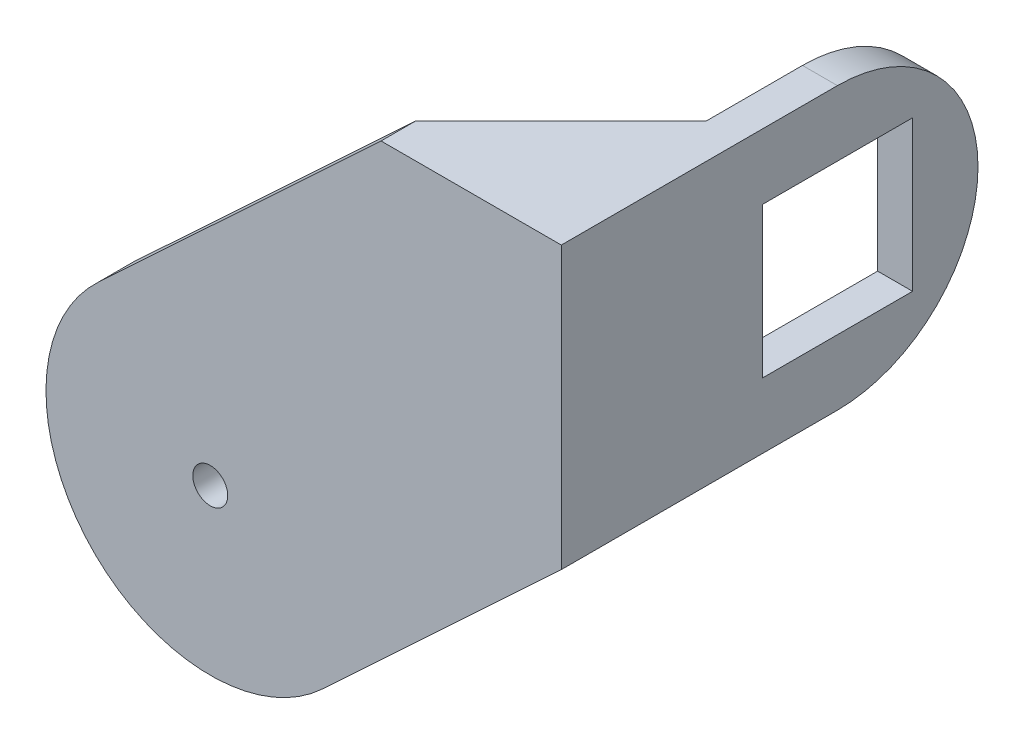
ISO-10303-21;
HEADER;
FILE_DESCRIPTION(('STEP AP214'),'2;1');
FILE_NAME('part.step','',(''),(''),'','','');
FILE_SCHEMA(('AUTOMOTIVE_DESIGN { 1 0 10303 214 1 1 1 1 }'));
ENDSEC;
DATA;
#1=APPLICATION_CONTEXT('core data for automotive mechanical design processes');
#2=APPLICATION_PROTOCOL_DEFINITION('international standard','automotive_design',2000,#1);
#3=PRODUCT_CONTEXT('',#1,'mechanical');
#4=PRODUCT('Part','Part','',(#3));
#5=PRODUCT_RELATED_PRODUCT_CATEGORY('part','',(#4));
#6=PRODUCT_DEFINITION_FORMATION('','',#4);
#7=PRODUCT_DEFINITION_CONTEXT('part definition',#1,'design');
#8=PRODUCT_DEFINITION('design','',#6,#7);
#9=PRODUCT_DEFINITION_SHAPE('','',#8);
#10=(LENGTH_UNIT() NAMED_UNIT(*) SI_UNIT(.MILLI.,.METRE.));
#11=(NAMED_UNIT(*) PLANE_ANGLE_UNIT() SI_UNIT($,.RADIAN.));
#12=(NAMED_UNIT(*) SI_UNIT($,.STERADIAN.) SOLID_ANGLE_UNIT());
#13=UNCERTAINTY_MEASURE_WITH_UNIT(LENGTH_MEASURE(1.E-05),#10,'distance_accuracy_value','');
#14=(GEOMETRIC_REPRESENTATION_CONTEXT(3) GLOBAL_UNCERTAINTY_ASSIGNED_CONTEXT((#13)) GLOBAL_UNIT_ASSIGNED_CONTEXT((#10,
#11,#12)) REPRESENTATION_CONTEXT('',''));
#15=CARTESIAN_POINT('',(0.,0.,0.));
#16=DIRECTION('',(0.,0.,1.));
#17=DIRECTION('',(1.,0.,0.));
#18=AXIS2_PLACEMENT_3D('',#15,#16,#17);
#19=CARTESIAN_POINT('',(831.596262739979,0.,0.));
#20=DIRECTION('',(1.,0.,0.));
#21=DIRECTION('',(0.,0.,-1.));
#22=AXIS2_PLACEMENT_3D('',#19,#20,#21);
#23=PLANE('',#22);
#24=DIRECTION('',(0.,0.,-1.));
#25=VECTOR('',#24,1.);
#26=CARTESIAN_POINT('',(831.596262739979,764.961811027833,0.));
#27=LINE('',#26,#25);
#28=CARTESIAN_POINT('',(831.596262739979,764.961811027833,-47.5000000000001));
#29=VERTEX_POINT('',#28);
#30=CARTESIAN_POINT('',(831.596262739979,764.961811027833,-90.5000000000001));
#31=VERTEX_POINT('',#30);
#32=EDGE_CURVE('E196',#29,#31,#27,.T.);
#33=ORIENTED_EDGE('',*,*,#32,.F.);
#34=DIRECTION('',(0.,-1.,0.));
#35=VECTOR('',#34,1.);
#36=CARTESIAN_POINT('',(831.596262739979,0.,-47.5000000000003));
#37=LINE('',#36,#35);
#38=CARTESIAN_POINT('',(831.596262739979,721.961811027833,-47.5000000000001));
#39=VERTEX_POINT('',#38);
#40=EDGE_CURVE('E204',#29,#39,#37,.T.);
#41=ORIENTED_EDGE('',*,*,#40,.T.);
#42=DIRECTION('',(0.,0.,-1.));
#43=VECTOR('',#42,1.);
#44=CARTESIAN_POINT('',(831.596262739979,721.961811027833,0.));
#45=LINE('',#44,#43);
#46=CARTESIAN_POINT('',(831.596262739979,721.961811027833,-90.5000000000001));
#47=VERTEX_POINT('',#46);
#48=EDGE_CURVE('E202',#39,#47,#45,.T.);
#49=ORIENTED_EDGE('',*,*,#48,.T.);
#50=DIRECTION('',(0.,-1.,0.));
#51=VECTOR('',#50,1.);
#52=CARTESIAN_POINT('',(831.596262739979,0.,-90.5000000000003));
#53=LINE('',#52,#51);
#54=EDGE_CURVE('E199',#31,#47,#53,.T.);
#55=ORIENTED_EDGE('',*,*,#54,.F.);
#56=EDGE_LOOP('',(#33,#41,#49,#55));
#57=FACE_BOUND('',#56,.T.);
#58=DIRECTION('',(0.,-1.,0.));
#59=VECTOR('',#58,1.);
#60=CARTESIAN_POINT('',(831.596262739979,713.245406231609,-41.5766151838099));
#61=LINE('',#60,#59);
#62=CARTESIAN_POINT('',(831.596262739979,713.245406231609,-41.5766151838099));
#63=VERTEX_POINT('',#62);
#64=CARTESIAN_POINT('',(831.596262739979,703.245406231609,-41.5766151838099));
#65=VERTEX_POINT('',#64);
#66=EDGE_CURVE('E179',#63,#65,#61,.T.);
#67=ORIENTED_EDGE('',*,*,#66,.F.);
#68=DIRECTION('',(0.,0.,-1.));
#69=VECTOR('',#68,1.);
#70=CARTESIAN_POINT('',(831.596262739979,713.245406231609,0.));
#71=LINE('',#70,#69);
#72=CARTESIAN_POINT('',(831.596262739979,713.245406231609,0.));
#73=VERTEX_POINT('',#72);
#74=EDGE_CURVE('E281',#73,#63,#71,.T.);
#75=ORIENTED_EDGE('',*,*,#74,.F.);
#76=DIRECTION('',(0.,1.,0.));
#77=VECTOR('',#76,1.);
#78=CARTESIAN_POINT('',(831.596262739979,0.,0.));
#79=LINE('',#78,#77);
#80=CARTESIAN_POINT('',(831.596262739979,773.678215824057,0.));
#81=VERTEX_POINT('',#80);
#82=EDGE_CURVE('E163',#73,#81,#79,.T.);
#83=ORIENTED_EDGE('',*,*,#82,.T.);
#84=DIRECTION('',(0.,0.,-1.));
#85=VECTOR('',#84,1.);
#86=CARTESIAN_POINT('',(831.596262739979,773.678215824057,0.));
#87=LINE('',#86,#85);
#88=CARTESIAN_POINT('',(831.596262739979,773.678215824057,-41.5766151838099));
#89=VERTEX_POINT('',#88);
#90=EDGE_CURVE('E169',#81,#89,#87,.T.);
#91=ORIENTED_EDGE('',*,*,#90,.T.);
#92=DIRECTION('',(0.,1.,0.));
#93=VECTOR('',#92,1.);
#94=CARTESIAN_POINT('',(831.596262739979,773.678215824057,-41.5766151838099));
#95=LINE('',#94,#93);
#96=CARTESIAN_POINT('',(831.596262739979,783.678215824057,-41.5766151838099));
#97=VERTEX_POINT('',#96);
#98=EDGE_CURVE('E167',#89,#97,#95,.T.);
#99=ORIENTED_EDGE('',*,*,#98,.T.);
#100=DIRECTION('',(0.,0.,-1.));
#101=VECTOR('',#100,1.);
#102=CARTESIAN_POINT('',(831.596262739979,783.678215824057,0.));
#103=LINE('',#102,#101);
#104=CARTESIAN_POINT('',(831.596262739979,783.678215824057,-69.));
#105=VERTEX_POINT('',#104);
#106=EDGE_CURVE('E152',#97,#105,#103,.T.);
#107=ORIENTED_EDGE('',*,*,#106,.T.);
#108=CARTESIAN_POINT('',(831.596262739979,743.461811027833,-69.));
#109=DIRECTION('',(1.,0.,0.));
#110=DIRECTION('',(0.,0.,-1.));
#111=AXIS2_PLACEMENT_3D('',#108,#109,#110);
#112=CIRCLE('',#111,40.2164047962241);
#113=CARTESIAN_POINT('',(831.596262739979,703.245406231609,-69.));
#114=VERTEX_POINT('',#113);
#115=EDGE_CURVE('E164',#105,#114,#112,.F.);
#116=ORIENTED_EDGE('',*,*,#115,.T.);
#117=DIRECTION('',(0.,0.,1.));
#118=VECTOR('',#117,1.);
#119=CARTESIAN_POINT('',(831.596262739979,703.245406231609,0.));
#120=LINE('',#119,#118);
#121=EDGE_CURVE('E194',#114,#65,#120,.T.);
#122=ORIENTED_EDGE('',*,*,#121,.T.);
#123=EDGE_LOOP('',(#67,#75,#83,#91,#99,#107,#116,#122));
#124=FACE_BOUND('',#123,.T.);
#125=ADVANCED_FACE('F43',(#57,#124),#23,.F.);
#126=CARTESIAN_POINT('',(0.,0.,0.));
#127=DIRECTION('',(0.,0.,1.));
#128=DIRECTION('',(1.,0.,0.));
#129=AXIS2_PLACEMENT_3D('',#126,#127,#128);
#130=PLANE('',#129);
#131=CARTESIAN_POINT('',(741.160932352825,673.852336136002,0.));
#132=DIRECTION('',(0.,0.,1.));
#133=DIRECTION('',(1.,0.,0.));
#134=AXIS2_PLACEMENT_3D('',#131,#132,#133);
#135=CIRCLE('',#134,5.00000000000005);
#136=CARTESIAN_POINT('',(746.160932352825,673.852336136002,0.));
#137=VERTEX_POINT('',#136);
#138=EDGE_CURVE('E224',#137,#137,#135,.T.);
#139=ORIENTED_EDGE('',*,*,#138,.T.);
#140=EDGE_LOOP('',(#139));
#141=FACE_BOUND('',#140,.T.);
#142=ORIENTED_EDGE('',*,*,#82,.F.);
#143=DIRECTION('',(1.,0.,0.));
#144=VECTOR('',#143,1.);
#145=CARTESIAN_POINT('',(831.596262739979,713.245406231609,0.));
#146=LINE('',#145,#144);
#147=CARTESIAN_POINT('',(790.019647556168,713.245406231609,0.));
#148=VERTEX_POINT('',#147);
#149=EDGE_CURVE('E58',#148,#73,#146,.T.);
#150=ORIENTED_EDGE('',*,*,#149,.F.);
#151=DIRECTION('',(0.,-1.,0.));
#152=VECTOR('',#151,1.);
#153=CARTESIAN_POINT('',(790.019647556168,713.245406231609,0.));
#154=LINE('',#153,#152);
#155=CARTESIAN_POINT('',(790.019647556168,703.245406231609,0.));
#156=VERTEX_POINT('',#155);
#157=EDGE_CURVE('E184',#148,#156,#154,.T.);
#158=ORIENTED_EDGE('',*,*,#157,.T.);
#159=DIRECTION('',(1.,0.,0.));
#160=VECTOR('',#159,1.);
#161=CARTESIAN_POINT('',(831.596262739979,703.245406231609,0.));
#162=LINE('',#161,#160);
#163=CARTESIAN_POINT('',(841.596262739979,703.245406231609,0.));
#164=VERTEX_POINT('',#163);
#165=EDGE_CURVE('E66',#156,#164,#162,.T.);
#166=ORIENTED_EDGE('',*,*,#165,.T.);
#167=DIRECTION('',(0.731353701619169,0.6819983600625,0.));
#168=VECTOR('',#167,1.);
#169=CARTESIAN_POINT('',(40.6785696839934,-43.622425297673,0.));
#170=LINE('',#169,#168);
#171=CARTESIAN_POINT('',(773.214855275763,639.478712159901,0.));
#172=VERTEX_POINT('',#171);
#173=EDGE_CURVE('E241',#172,#164,#170,.T.);
#174=ORIENTED_EDGE('',*,*,#173,.F.);
#175=CARTESIAN_POINT('',(741.160932352825,673.852336136002,0.));
#176=DIRECTION('',(0.,0.,1.));
#177=DIRECTION('',(1.,0.,0.));
#178=AXIS2_PLACEMENT_3D('',#175,#176,#177);
#179=CIRCLE('',#178,47.);
#180=CARTESIAN_POINT('',(709.107009429888,708.225960112103,0.));
#181=VERTEX_POINT('',#180);
#182=EDGE_CURVE('E258',#181,#172,#179,.T.);
#183=ORIENTED_EDGE('',*,*,#182,.F.);
#184=DIRECTION('',(-0.731353701619169,-0.6819983600625,0.));
#185=VECTOR('',#184,1.);
#186=CARTESIAN_POINT('',(-23.4292761618817,25.124822654529,0.));
#187=LINE('',#186,#185);
#188=CARTESIAN_POINT('',(790.019647556168,783.678215824057,0.));
#189=VERTEX_POINT('',#188);
#190=EDGE_CURVE('E255',#189,#181,#187,.T.);
#191=ORIENTED_EDGE('',*,*,#190,.F.);
#192=DIRECTION('',(0.,1.,0.));
#193=VECTOR('',#192,1.);
#194=CARTESIAN_POINT('',(790.019647556168,773.678215824057,0.));
#195=LINE('',#194,#193);
#196=CARTESIAN_POINT('',(790.019647556168,773.678215824057,0.));
#197=VERTEX_POINT('',#196);
#198=EDGE_CURVE('E173',#197,#189,#195,.T.);
#199=ORIENTED_EDGE('',*,*,#198,.F.);
#200=DIRECTION('',(1.,0.,0.));
#201=VECTOR('',#200,1.);
#202=CARTESIAN_POINT('',(831.596262739979,773.678215824057,0.));
#203=LINE('',#202,#201);
#204=EDGE_CURVE('E178',#197,#81,#203,.T.);
#205=ORIENTED_EDGE('',*,*,#204,.T.);
#206=EDGE_LOOP('',(#142,#150,#158,#166,#174,#183,#191,#199,#205));
#207=FACE_BOUND('',#206,.T.);
#208=ADVANCED_FACE('F275',(#141,#207),#130,.F.);
#209=CARTESIAN_POINT('',(-23.4292761618817,25.124822654529,10.));
#210=DIRECTION('',(0.6819983600625,-0.731353701619169,0.));
#211=DIRECTION('',(0.731353701619169,0.6819983600625,0.));
#212=AXIS2_PLACEMENT_3D('',#209,#210,#211);
#213=PLANE('',#212);
#214=ORIENTED_EDGE('',*,*,#190,.T.);
#215=DIRECTION('',(0.,0.,-1.));
#216=VECTOR('',#215,1.);
#217=CARTESIAN_POINT('',(709.107009429888,708.225960112103,10.));
#218=LINE('',#217,#216);
#219=CARTESIAN_POINT('',(709.107009429888,708.225960112103,10.));
#220=VERTEX_POINT('',#219);
#221=EDGE_CURVE('E11',#220,#181,#218,.T.);
#222=ORIENTED_EDGE('',*,*,#221,.F.);
#223=DIRECTION('',(-0.731353701619169,-0.6819983600625,0.));
#224=VECTOR('',#223,1.);
#225=CARTESIAN_POINT('',(-23.4292761618817,25.124822654529,10.));
#226=LINE('',#225,#224);
#227=CARTESIAN_POINT('',(790.019647556168,783.678215824057,10.));
#228=VERTEX_POINT('',#227);
#229=EDGE_CURVE('E240',#228,#220,#226,.T.);
#230=ORIENTED_EDGE('',*,*,#229,.F.);
#231=DIRECTION('',(0.,0.,-1.));
#232=VECTOR('',#231,1.);
#233=CARTESIAN_POINT('',(790.019647556168,783.678215824057,10.));
#234=LINE('',#233,#232);
#235=EDGE_CURVE('E252',#228,#189,#234,.T.);
#236=ORIENTED_EDGE('',*,*,#235,.T.);
#237=EDGE_LOOP('',(#214,#222,#230,#236));
#238=FACE_BOUND('',#237,.T.);
#239=ADVANCED_FACE('F295',(#238),#213,.F.);
#240=CARTESIAN_POINT('',(741.160932352825,673.852336136002,10.));
#241=DIRECTION('',(0.,0.,-1.));
#242=DIRECTION('',(-1.,0.,0.));
#243=AXIS2_PLACEMENT_3D('',#240,#241,#242);
#244=CYLINDRICAL_SURFACE('',#243,47.);
#245=ORIENTED_EDGE('',*,*,#182,.T.);
#246=DIRECTION('',(0.,0.,-1.));
#247=VECTOR('',#246,1.);
#248=CARTESIAN_POINT('',(773.214855275763,639.478712159901,10.));
#249=LINE('',#248,#247);
#250=CARTESIAN_POINT('',(773.214855275763,639.478712159901,10.));
#251=VERTEX_POINT('',#250);
#252=EDGE_CURVE('E51',#251,#172,#249,.T.);
#253=ORIENTED_EDGE('',*,*,#252,.F.);
#254=CARTESIAN_POINT('',(741.160932352825,673.852336136002,10.));
#255=DIRECTION('',(0.,0.,1.));
#256=DIRECTION('',(1.,0.,0.));
#257=AXIS2_PLACEMENT_3D('',#254,#255,#256);
#258=CIRCLE('',#257,47.);
#259=EDGE_CURVE('E244',#220,#251,#258,.T.);
#260=ORIENTED_EDGE('',*,*,#259,.F.);
#261=ORIENTED_EDGE('',*,*,#221,.T.);
#262=EDGE_LOOP('',(#245,#253,#260,#261));
#263=FACE_BOUND('',#262,.T.);
#264=ADVANCED_FACE('F365',(#263),#244,.T.);
#265=CARTESIAN_POINT('',(40.6785696839934,-43.622425297673,10.));
#266=DIRECTION('',(-0.6819983600625,0.731353701619169,0.));
#267=DIRECTION('',(-0.731353701619169,-0.6819983600625,0.));
#268=AXIS2_PLACEMENT_3D('',#265,#266,#267);
#269=PLANE('',#268);
#270=ORIENTED_EDGE('',*,*,#173,.T.);
#271=DIRECTION('',(0.,0.,-1.));
#272=VECTOR('',#271,1.);
#273=CARTESIAN_POINT('',(841.596262739979,703.245406231609,10.));
#274=LINE('',#273,#272);
#275=CARTESIAN_POINT('',(841.596262739979,703.245406231609,10.));
#276=VERTEX_POINT('',#275);
#277=EDGE_CURVE('E265',#276,#164,#274,.T.);
#278=ORIENTED_EDGE('',*,*,#277,.F.);
#279=DIRECTION('',(0.731353701619169,0.6819983600625,0.));
#280=VECTOR('',#279,1.);
#281=CARTESIAN_POINT('',(40.6785696839934,-43.622425297673,10.));
#282=LINE('',#281,#280);
#283=EDGE_CURVE('E246',#251,#276,#282,.T.);
#284=ORIENTED_EDGE('',*,*,#283,.F.);
#285=ORIENTED_EDGE('',*,*,#252,.T.);
#286=EDGE_LOOP('',(#270,#278,#284,#285));
#287=FACE_BOUND('',#286,.T.);
#288=ADVANCED_FACE('F272',(#287),#269,.F.);
#289=CARTESIAN_POINT('',(841.596262739979,0.,10.));
#290=DIRECTION('',(-1.,0.,0.));
#291=DIRECTION('',(0.,0.,1.));
#292=AXIS2_PLACEMENT_3D('',#289,#290,#291);
#293=PLANE('',#292);
#294=ORIENTED_EDGE('',*,*,#277,.T.);
#295=DIRECTION('',(0.,0.,1.));
#296=VECTOR('',#295,1.);
#297=CARTESIAN_POINT('',(841.596262739979,703.245406231609,0.));
#298=LINE('',#297,#296);
#299=CARTESIAN_POINT('',(841.596262739979,703.245406231609,-69.));
#300=VERTEX_POINT('',#299);
#301=EDGE_CURVE('E209',#300,#164,#298,.T.);
#302=ORIENTED_EDGE('',*,*,#301,.F.);
#303=CARTESIAN_POINT('',(841.596262739979,743.461811027833,-69.));
#304=DIRECTION('',(1.,0.,0.));
#305=DIRECTION('',(0.,0.,-1.));
#306=AXIS2_PLACEMENT_3D('',#303,#304,#305);
#307=CIRCLE('',#306,40.2164047962241);
#308=CARTESIAN_POINT('',(841.596262739979,783.678215824057,-69.));
#309=VERTEX_POINT('',#308);
#310=EDGE_CURVE('E189',#309,#300,#307,.F.);
#311=ORIENTED_EDGE('',*,*,#310,.F.);
#312=DIRECTION('',(0.,0.,-1.));
#313=VECTOR('',#312,1.);
#314=CARTESIAN_POINT('',(841.596262739979,783.678215824057,10.));
#315=LINE('',#314,#313);
#316=CARTESIAN_POINT('',(841.596262739979,783.678215824057,10.));
#317=VERTEX_POINT('',#316);
#318=EDGE_CURVE('E263',#317,#309,#315,.T.);
#319=ORIENTED_EDGE('',*,*,#318,.F.);
#320=DIRECTION('',(0.,1.,0.));
#321=VECTOR('',#320,1.);
#322=CARTESIAN_POINT('',(841.596262739979,0.,10.));
#323=LINE('',#322,#321);
#324=EDGE_CURVE('E248',#276,#317,#323,.T.);
#325=ORIENTED_EDGE('',*,*,#324,.F.);
#326=EDGE_LOOP('',(#294,#302,#311,#319,#325));
#327=FACE_BOUND('',#326,.T.);
#328=DIRECTION('',(0.,0.,-1.));
#329=VECTOR('',#328,1.);
#330=CARTESIAN_POINT('',(841.596262739979,764.961811027833,0.));
#331=LINE('',#330,#329);
#332=CARTESIAN_POINT('',(841.596262739979,764.961811027833,-47.5000000000001));
#333=VERTEX_POINT('',#332);
#334=CARTESIAN_POINT('',(841.596262739979,764.961811027833,-90.5000000000001));
#335=VERTEX_POINT('',#334);
#336=EDGE_CURVE('E211',#333,#335,#331,.T.);
#337=ORIENTED_EDGE('',*,*,#336,.T.);
#338=DIRECTION('',(0.,-1.,0.));
#339=VECTOR('',#338,1.);
#340=CARTESIAN_POINT('',(841.596262739979,0.,-90.5000000000003));
#341=LINE('',#340,#339);
#342=CARTESIAN_POINT('',(841.596262739979,721.961811027833,-90.5000000000001));
#343=VERTEX_POINT('',#342);
#344=EDGE_CURVE('E214',#335,#343,#341,.T.);
#345=ORIENTED_EDGE('',*,*,#344,.T.);
#346=DIRECTION('',(0.,0.,-1.));
#347=VECTOR('',#346,1.);
#348=CARTESIAN_POINT('',(841.596262739979,721.961811027833,0.));
#349=LINE('',#348,#347);
#350=CARTESIAN_POINT('',(841.596262739979,721.961811027833,-47.5000000000001));
#351=VERTEX_POINT('',#350);
#352=EDGE_CURVE('E217',#351,#343,#349,.T.);
#353=ORIENTED_EDGE('',*,*,#352,.F.);
#354=DIRECTION('',(0.,-1.,0.));
#355=VECTOR('',#354,1.);
#356=CARTESIAN_POINT('',(841.596262739979,0.,-47.5000000000003));
#357=LINE('',#356,#355);
#358=EDGE_CURVE('E191',#333,#351,#357,.T.);
#359=ORIENTED_EDGE('',*,*,#358,.F.);
#360=EDGE_LOOP('',(#337,#345,#353,#359));
#361=FACE_BOUND('',#360,.T.);
#362=ADVANCED_FACE('F304',(#327,#361),#293,.F.);
#363=CARTESIAN_POINT('',(741.160932352825,673.852336136002,10.));
#364=DIRECTION('',(0.,0.,-1.));
#365=DIRECTION('',(-1.,0.,0.));
#366=AXIS2_PLACEMENT_3D('',#363,#364,#365);
#367=CYLINDRICAL_SURFACE('',#366,5.00000000000005);
#368=CARTESIAN_POINT('',(741.160932352825,673.852336136002,10.));
#369=DIRECTION('',(0.,0.,1.));
#370=DIRECTION('',(1.,0.,0.));
#371=AXIS2_PLACEMENT_3D('',#368,#369,#370);
#372=CIRCLE('',#371,5.00000000000005);
#373=CARTESIAN_POINT('',(746.160932352825,673.852336136002,10.));
#374=VERTEX_POINT('',#373);
#375=EDGE_CURVE('E237',#374,#374,#372,.T.);
#376=ORIENTED_EDGE('',*,*,#375,.T.);
#377=EDGE_LOOP('',(#376));
#378=FACE_BOUND('',#377,.T.);
#379=ORIENTED_EDGE('',*,*,#138,.F.);
#380=EDGE_LOOP('',(#379));
#381=FACE_BOUND('',#380,.T.);
#382=ADVANCED_FACE('F45',(#378,#381),#367,.F.);
#383=CARTESIAN_POINT('',(0.,783.678215824057,10.));
#384=DIRECTION('',(0.,-1.,0.));
#385=DIRECTION('',(0.,0.,-1.));
#386=AXIS2_PLACEMENT_3D('',#383,#384,#385);
#387=PLANE('',#386);
#388=DIRECTION('',(-0.707106781186551,0.,0.707106781186544));
#389=VECTOR('',#388,1.);
#390=CARTESIAN_POINT('',(790.019647556168,783.678215824057,0.));
#391=LINE('',#390,#389);
#392=EDGE_CURVE('E157',#97,#189,#391,.T.);
#393=ORIENTED_EDGE('',*,*,#392,.T.);
#394=ORIENTED_EDGE('',*,*,#235,.F.);
#395=DIRECTION('',(-1.,0.,0.));
#396=VECTOR('',#395,1.);
#397=CARTESIAN_POINT('',(0.,783.678215824057,10.));
#398=LINE('',#397,#396);
#399=EDGE_CURVE('E250',#317,#228,#398,.T.);
#400=ORIENTED_EDGE('',*,*,#399,.F.);
#401=ORIENTED_EDGE('',*,*,#318,.T.);
#402=DIRECTION('',(1.,0.,0.));
#403=VECTOR('',#402,1.);
#404=CARTESIAN_POINT('',(831.596262739979,783.678215824057,-69.));
#405=LINE('',#404,#403);
#406=EDGE_CURVE('E159',#105,#309,#405,.T.);
#407=ORIENTED_EDGE('',*,*,#406,.F.);
#408=ORIENTED_EDGE('',*,*,#106,.F.);
#409=EDGE_LOOP('',(#393,#394,#400,#401,#407,#408));
#410=FACE_BOUND('',#409,.T.);
#411=ADVANCED_FACE('F154',(#410),#387,.F.);
#412=CARTESIAN_POINT('',(0.,0.,10.));
#413=DIRECTION('',(0.,0.,1.));
#414=DIRECTION('',(1.,0.,0.));
#415=AXIS2_PLACEMENT_3D('',#412,#413,#414);
#416=PLANE('',#415);
#417=ORIENTED_EDGE('',*,*,#375,.F.);
#418=EDGE_LOOP('',(#417));
#419=FACE_BOUND('',#418,.T.);
#420=ORIENTED_EDGE('',*,*,#229,.T.);
#421=ORIENTED_EDGE('',*,*,#259,.T.);
#422=ORIENTED_EDGE('',*,*,#283,.T.);
#423=ORIENTED_EDGE('',*,*,#324,.T.);
#424=ORIENTED_EDGE('',*,*,#399,.T.);
#425=EDGE_LOOP('',(#420,#421,#422,#423,#424));
#426=FACE_BOUND('',#425,.T.);
#427=ADVANCED_FACE('F300',(#419,#426),#416,.T.);
#428=CARTESIAN_POINT('',(831.596262739979,764.961811027833,0.));
#429=DIRECTION('',(0.,-1.,0.));
#430=DIRECTION('',(0.,0.,-1.));
#431=AXIS2_PLACEMENT_3D('',#428,#429,#430);
#432=PLANE('',#431);
#433=ORIENTED_EDGE('',*,*,#336,.F.);
#434=DIRECTION('',(1.,0.,0.));
#435=VECTOR('',#434,1.);
#436=CARTESIAN_POINT('',(831.596262739979,764.961811027833,-47.5000000000001));
#437=LINE('',#436,#435);
#438=EDGE_CURVE('E222',#29,#333,#437,.T.);
#439=ORIENTED_EDGE('',*,*,#438,.F.);
#440=ORIENTED_EDGE('',*,*,#32,.T.);
#441=DIRECTION('',(1.,0.,0.));
#442=VECTOR('',#441,1.);
#443=CARTESIAN_POINT('',(831.596262739979,764.961811027833,-90.5000000000001));
#444=LINE('',#443,#442);
#445=EDGE_CURVE('E230',#31,#335,#444,.T.);
#446=ORIENTED_EDGE('',*,*,#445,.T.);
#447=EDGE_LOOP('',(#433,#439,#440,#446));
#448=FACE_BOUND('',#447,.T.);
#449=ADVANCED_FACE('F340',(#448),#432,.T.);
#450=CARTESIAN_POINT('',(831.596262739979,0.,-47.5000000000003));
#451=DIRECTION('',(0.,0.,1.));
#452=DIRECTION('',(0.,-1.,0.));
#453=AXIS2_PLACEMENT_3D('',#450,#451,#452);
#454=PLANE('',#453);
#455=ORIENTED_EDGE('',*,*,#358,.T.);
#456=DIRECTION('',(1.,0.,0.));
#457=VECTOR('',#456,1.);
#458=CARTESIAN_POINT('',(831.596262739979,721.961811027833,-47.5000000000001));
#459=LINE('',#458,#457);
#460=EDGE_CURVE('E225',#39,#351,#459,.T.);
#461=ORIENTED_EDGE('',*,*,#460,.F.);
#462=ORIENTED_EDGE('',*,*,#40,.F.);
#463=ORIENTED_EDGE('',*,*,#438,.T.);
#464=EDGE_LOOP('',(#455,#461,#462,#463));
#465=FACE_BOUND('',#464,.T.);
#466=ADVANCED_FACE('F337',(#465),#454,.F.);
#467=CARTESIAN_POINT('',(831.596262739979,721.961811027833,0.));
#468=DIRECTION('',(0.,-1.,0.));
#469=DIRECTION('',(0.,0.,-1.));
#470=AXIS2_PLACEMENT_3D('',#467,#468,#469);
#471=PLANE('',#470);
#472=ORIENTED_EDGE('',*,*,#352,.T.);
#473=DIRECTION('',(1.,0.,0.));
#474=VECTOR('',#473,1.);
#475=CARTESIAN_POINT('',(831.596262739979,721.961811027833,-90.5000000000001));
#476=LINE('',#475,#474);
#477=EDGE_CURVE('E228',#47,#343,#476,.T.);
#478=ORIENTED_EDGE('',*,*,#477,.F.);
#479=ORIENTED_EDGE('',*,*,#48,.F.);
#480=ORIENTED_EDGE('',*,*,#460,.T.);
#481=EDGE_LOOP('',(#472,#478,#479,#480));
#482=FACE_BOUND('',#481,.T.);
#483=ADVANCED_FACE('F322',(#482),#471,.F.);
#484=CARTESIAN_POINT('',(831.596262739979,743.461811027833,-69.));
#485=DIRECTION('',(1.,0.,0.));
#486=DIRECTION('',(0.,0.,-1.));
#487=AXIS2_PLACEMENT_3D('',#484,#485,#486);
#488=CYLINDRICAL_SURFACE('',#487,40.2164047962241);
#489=ORIENTED_EDGE('',*,*,#310,.T.);
#490=DIRECTION('',(1.,0.,0.));
#491=VECTOR('',#490,1.);
#492=CARTESIAN_POINT('',(831.596262739979,703.245406231609,-69.));
#493=LINE('',#492,#491);
#494=EDGE_CURVE('E232',#114,#300,#493,.T.);
#495=ORIENTED_EDGE('',*,*,#494,.F.);
#496=ORIENTED_EDGE('',*,*,#115,.F.);
#497=ORIENTED_EDGE('',*,*,#406,.T.);
#498=EDGE_LOOP('',(#489,#495,#496,#497));
#499=FACE_BOUND('',#498,.T.);
#500=ADVANCED_FACE('F308',(#499),#488,.T.);
#501=CARTESIAN_POINT('',(831.596262739979,703.245406231609,0.));
#502=DIRECTION('',(0.,1.,0.));
#503=DIRECTION('',(0.,0.,1.));
#504=AXIS2_PLACEMENT_3D('',#501,#502,#503);
#505=PLANE('',#504);
#506=ORIENTED_EDGE('',*,*,#301,.T.);
#507=ORIENTED_EDGE('',*,*,#165,.F.);
#508=DIRECTION('',(-0.707106781186551,0.,0.707106781186544));
#509=VECTOR('',#508,1.);
#510=CARTESIAN_POINT('',(790.019647556168,703.245406231609,0.));
#511=LINE('',#510,#509);
#512=EDGE_CURVE('E283',#65,#156,#511,.T.);
#513=ORIENTED_EDGE('',*,*,#512,.F.);
#514=ORIENTED_EDGE('',*,*,#121,.F.);
#515=ORIENTED_EDGE('',*,*,#494,.T.);
#516=EDGE_LOOP('',(#506,#507,#513,#514,#515));
#517=FACE_BOUND('',#516,.T.);
#518=ADVANCED_FACE('F310',(#517),#505,.F.);
#519=CARTESIAN_POINT('',(831.596262739979,0.,-90.5000000000003));
#520=DIRECTION('',(0.,0.,1.));
#521=DIRECTION('',(0.,-1.,0.));
#522=AXIS2_PLACEMENT_3D('',#519,#520,#521);
#523=PLANE('',#522);
#524=ORIENTED_EDGE('',*,*,#344,.F.);
#525=ORIENTED_EDGE('',*,*,#445,.F.);
#526=ORIENTED_EDGE('',*,*,#54,.T.);
#527=ORIENTED_EDGE('',*,*,#477,.T.);
#528=EDGE_LOOP('',(#524,#525,#526,#527));
#529=FACE_BOUND('',#528,.T.);
#530=ADVANCED_FACE('F312',(#529),#523,.T.);
#531=CARTESIAN_POINT('',(790.019647556168,773.678215824057,0.));
#532=DIRECTION('',(-0.707106781186544,0.,-0.707106781186551));
#533=DIRECTION('',(-0.707106781186551,0.,0.707106781186544));
#534=AXIS2_PLACEMENT_3D('',#531,#532,#533);
#535=PLANE('',#534);
#536=ORIENTED_EDGE('',*,*,#392,.F.);
#537=ORIENTED_EDGE('',*,*,#98,.F.);
#538=DIRECTION('',(-0.707106781186551,0.,0.707106781186544));
#539=VECTOR('',#538,1.);
#540=CARTESIAN_POINT('',(790.019647556168,773.678215824057,0.));
#541=LINE('',#540,#539);
#542=EDGE_CURVE('E174',#89,#197,#541,.T.);
#543=ORIENTED_EDGE('',*,*,#542,.T.);
#544=ORIENTED_EDGE('',*,*,#198,.T.);
#545=EDGE_LOOP('',(#536,#537,#543,#544));
#546=FACE_BOUND('',#545,.T.);
#547=ADVANCED_FACE('F177',(#546),#535,.T.);
#548=CARTESIAN_POINT('',(0.,773.678215824057,0.));
#549=DIRECTION('',(0.,-1.,0.));
#550=DIRECTION('',(0.,0.,-1.));
#551=AXIS2_PLACEMENT_3D('',#548,#549,#550);
#552=PLANE('',#551);
#553=ORIENTED_EDGE('',*,*,#204,.F.);
#554=ORIENTED_EDGE('',*,*,#542,.F.);
#555=ORIENTED_EDGE('',*,*,#90,.F.);
#556=EDGE_LOOP('',(#553,#554,#555));
#557=FACE_BOUND('',#556,.T.);
#558=ADVANCED_FACE('F292',(#557),#552,.T.);
#559=CARTESIAN_POINT('',(790.019647556168,713.245406231609,0.));
#560=DIRECTION('',(0.707106781186544,0.,0.707106781186551));
#561=DIRECTION('',(0.707106781186551,0.,-0.707106781186544));
#562=AXIS2_PLACEMENT_3D('',#559,#560,#561);
#563=PLANE('',#562);
#564=ORIENTED_EDGE('',*,*,#512,.T.);
#565=ORIENTED_EDGE('',*,*,#157,.F.);
#566=DIRECTION('',(-0.707106781186551,0.,0.707106781186544));
#567=VECTOR('',#566,1.);
#568=CARTESIAN_POINT('',(790.019647556168,713.245406231609,0.));
#569=LINE('',#568,#567);
#570=EDGE_CURVE('E286',#63,#148,#569,.T.);
#571=ORIENTED_EDGE('',*,*,#570,.F.);
#572=ORIENTED_EDGE('',*,*,#66,.T.);
#573=EDGE_LOOP('',(#564,#565,#571,#572));
#574=FACE_BOUND('',#573,.T.);
#575=ADVANCED_FACE('F284',(#574),#563,.F.);
#576=CARTESIAN_POINT('',(0.,713.245406231609,0.));
#577=DIRECTION('',(0.,1.,0.));
#578=DIRECTION('',(0.,0.,-1.));
#579=AXIS2_PLACEMENT_3D('',#576,#577,#578);
#580=PLANE('',#579);
#581=ORIENTED_EDGE('',*,*,#149,.T.);
#582=ORIENTED_EDGE('',*,*,#74,.T.);
#583=ORIENTED_EDGE('',*,*,#570,.T.);
#584=EDGE_LOOP('',(#581,#582,#583));
#585=FACE_BOUND('',#584,.T.);
#586=ADVANCED_FACE('F413',(#585),#580,.T.);
#587=CLOSED_SHELL('',(#125,#208,#239,#264,#288,#362,#382,#411,#427,#449,#466,#483,#500,#518,
#530,#547,#558,#575,#586));
#588=MANIFOLD_SOLID_BREP('B2',#587);
#589=ADVANCED_BREP_SHAPE_REPRESENTATION('',(#18,#588),#14);
#590=SHAPE_DEFINITION_REPRESENTATION(#9,#589);
ENDSEC;
END-ISO-10303-21;
